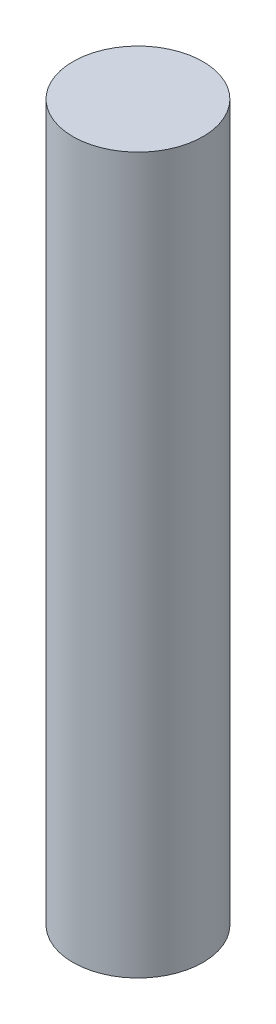
ISO-10303-21;
HEADER;
FILE_DESCRIPTION(('STEP AP214'),'2;1');
FILE_NAME('part.step','',(''),(''),'','','');
FILE_SCHEMA(('AUTOMOTIVE_DESIGN { 1 0 10303 214 1 1 1 1 }'));
ENDSEC;
DATA;
#1=APPLICATION_CONTEXT('core data for automotive mechanical design processes');
#2=APPLICATION_PROTOCOL_DEFINITION('international standard','automotive_design',2000,#1);
#3=PRODUCT_CONTEXT('',#1,'mechanical');
#4=PRODUCT('Part','Part','',(#3));
#5=PRODUCT_RELATED_PRODUCT_CATEGORY('part','',(#4));
#6=PRODUCT_DEFINITION_FORMATION('','',#4);
#7=PRODUCT_DEFINITION_CONTEXT('part definition',#1,'design');
#8=PRODUCT_DEFINITION('design','',#6,#7);
#9=PRODUCT_DEFINITION_SHAPE('','',#8);
#10=(LENGTH_UNIT() NAMED_UNIT(*) SI_UNIT(.MILLI.,.METRE.));
#11=(NAMED_UNIT(*) PLANE_ANGLE_UNIT() SI_UNIT($,.RADIAN.));
#12=(NAMED_UNIT(*) SI_UNIT($,.STERADIAN.) SOLID_ANGLE_UNIT());
#13=UNCERTAINTY_MEASURE_WITH_UNIT(LENGTH_MEASURE(1.E-05),#10,'distance_accuracy_value','');
#14=(GEOMETRIC_REPRESENTATION_CONTEXT(3) GLOBAL_UNCERTAINTY_ASSIGNED_CONTEXT((#13)) GLOBAL_UNIT_ASSIGNED_CONTEXT((#10,
#11,#12)) REPRESENTATION_CONTEXT('',''));
#15=CARTESIAN_POINT('',(0.,0.,0.));
#16=DIRECTION('',(0.,0.,1.));
#17=DIRECTION('',(1.,0.,0.));
#18=AXIS2_PLACEMENT_3D('',#15,#16,#17);
#19=CARTESIAN_POINT('',(0.,1100.,0.));
#20=DIRECTION('',(0.,-1.,0.));
#21=DIRECTION('',(0.,0.,-1.));
#22=AXIS2_PLACEMENT_3D('',#19,#20,#21);
#23=CYLINDRICAL_SURFACE('',#22,100.);
#24=CARTESIAN_POINT('',(0.,1100.,0.));
#25=DIRECTION('',(0.,1.,0.));
#26=DIRECTION('',(0.,0.,1.));
#27=AXIS2_PLACEMENT_3D('',#24,#25,#26);
#28=CIRCLE('',#27,100.);
#29=CARTESIAN_POINT('',(0.,1100.,100.));
#30=VERTEX_POINT('',#29);
#31=EDGE_CURVE('E10',#30,#30,#28,.T.);
#32=ORIENTED_EDGE('',*,*,#31,.F.);
#33=EDGE_LOOP('',(#32));
#34=FACE_BOUND('',#33,.T.);
#35=CARTESIAN_POINT('',(0.,0.,0.));
#36=DIRECTION('',(0.,1.,0.));
#37=DIRECTION('',(0.,0.,1.));
#38=AXIS2_PLACEMENT_3D('',#35,#36,#37);
#39=CIRCLE('',#38,100.);
#40=CARTESIAN_POINT('',(0.,0.,100.));
#41=VERTEX_POINT('',#40);
#42=EDGE_CURVE('E31',#41,#41,#39,.T.);
#43=ORIENTED_EDGE('',*,*,#42,.T.);
#44=EDGE_LOOP('',(#43));
#45=FACE_BOUND('',#44,.T.);
#46=ADVANCED_FACE('F28',(#34,#45),#23,.T.);
#47=CARTESIAN_POINT('',(0.,1100.,0.));
#48=DIRECTION('',(0.,1.,0.));
#49=DIRECTION('',(0.,0.,1.));
#50=AXIS2_PLACEMENT_3D('',#47,#48,#49);
#51=PLANE('',#50);
#52=ORIENTED_EDGE('',*,*,#31,.T.);
#53=EDGE_LOOP('',(#52));
#54=FACE_BOUND('',#53,.T.);
#55=ADVANCED_FACE('F43',(#54),#51,.T.);
#56=CARTESIAN_POINT('',(0.,0.,0.));
#57=DIRECTION('',(0.,1.,0.));
#58=DIRECTION('',(0.,0.,1.));
#59=AXIS2_PLACEMENT_3D('',#56,#57,#58);
#60=PLANE('',#59);
#61=ORIENTED_EDGE('',*,*,#42,.F.);
#62=EDGE_LOOP('',(#61));
#63=FACE_BOUND('',#62,.T.);
#64=ADVANCED_FACE('F41',(#63),#60,.F.);
#65=CLOSED_SHELL('',(#46,#55,#64));
#66=MANIFOLD_SOLID_BREP('B2',#65);
#67=ADVANCED_BREP_SHAPE_REPRESENTATION('',(#18,#66),#14);
#68=SHAPE_DEFINITION_REPRESENTATION(#9,#67);
ENDSEC;
END-ISO-10303-21;
